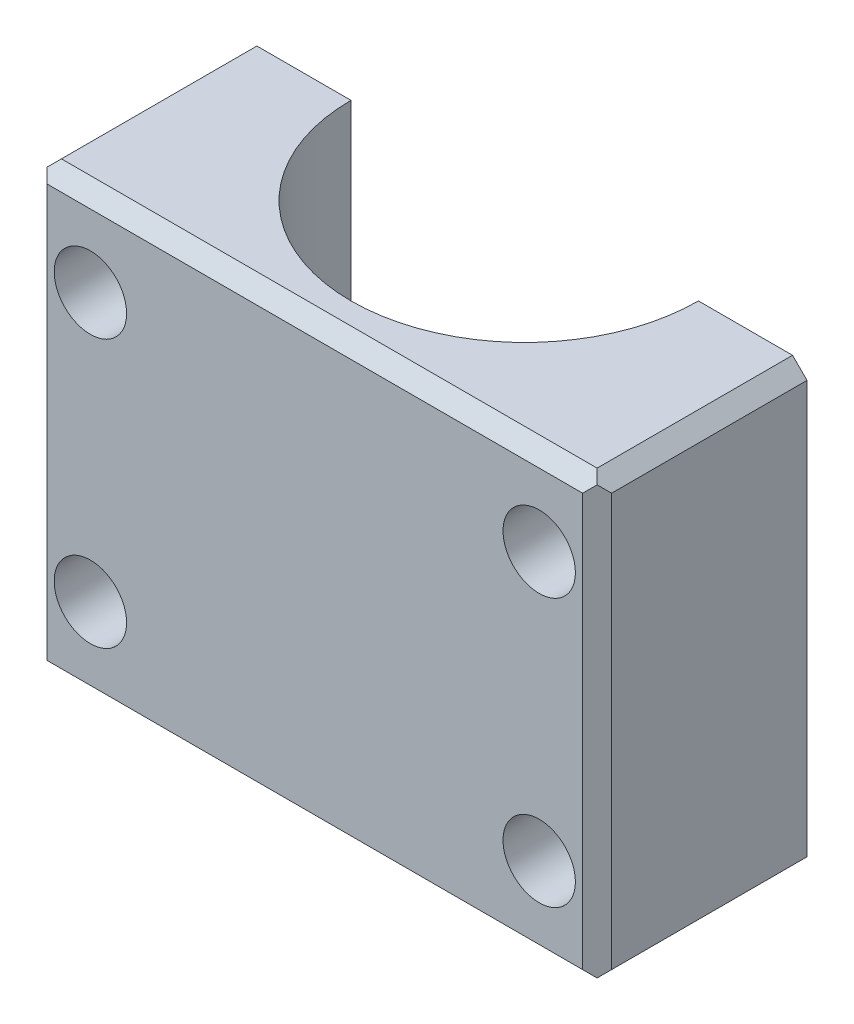
ISO-10303-21;
HEADER;
FILE_DESCRIPTION(('STEP AP214'),'2;1');
FILE_NAME('part.step','',(''),(''),'','','');
FILE_SCHEMA(('AUTOMOTIVE_DESIGN { 1 0 10303 214 1 1 1 1 }'));
ENDSEC;
DATA;
#1=APPLICATION_CONTEXT('core data for automotive mechanical design processes');
#2=APPLICATION_PROTOCOL_DEFINITION('international standard','automotive_design',2000,#1);
#3=PRODUCT_CONTEXT('',#1,'mechanical');
#4=PRODUCT('Part','Part','',(#3));
#5=PRODUCT_RELATED_PRODUCT_CATEGORY('part','',(#4));
#6=PRODUCT_DEFINITION_FORMATION('','',#4);
#7=PRODUCT_DEFINITION_CONTEXT('part definition',#1,'design');
#8=PRODUCT_DEFINITION('design','',#6,#7);
#9=PRODUCT_DEFINITION_SHAPE('','',#8);
#10=(LENGTH_UNIT() NAMED_UNIT(*) SI_UNIT(.MILLI.,.METRE.));
#11=(NAMED_UNIT(*) PLANE_ANGLE_UNIT() SI_UNIT($,.RADIAN.));
#12=(NAMED_UNIT(*) SI_UNIT($,.STERADIAN.) SOLID_ANGLE_UNIT());
#13=UNCERTAINTY_MEASURE_WITH_UNIT(LENGTH_MEASURE(1.E-05),#10,'distance_accuracy_value','');
#14=(GEOMETRIC_REPRESENTATION_CONTEXT(3) GLOBAL_UNCERTAINTY_ASSIGNED_CONTEXT((#13)) GLOBAL_UNIT_ASSIGNED_CONTEXT((#10,
#11,#12)) REPRESENTATION_CONTEXT('',''));
#15=CARTESIAN_POINT('',(0.,0.,0.));
#16=DIRECTION('',(0.,0.,1.));
#17=DIRECTION('',(1.,0.,0.));
#18=AXIS2_PLACEMENT_3D('',#15,#16,#17);
#19=CARTESIAN_POINT('',(0.,-30.5,58.));
#20=DIRECTION('',(0.,1.,0.));
#21=DIRECTION('',(0.,0.,1.));
#22=AXIS2_PLACEMENT_3D('',#19,#20,#21);
#23=PLANE('',#22);
#24=DIRECTION('',(-1.,0.,0.));
#25=VECTOR('',#24,1.);
#26=CARTESIAN_POINT('',(-37.,-30.5,56.));
#27=LINE('',#26,#25);
#28=CARTESIAN_POINT('',(-5.2201532544553,-30.5,56.));
#29=VERTEX_POINT('',#28);
#30=CARTESIAN_POINT('',(-37.,-30.5,56.));
#31=VERTEX_POINT('',#30);
#32=EDGE_CURVE('E268',#29,#31,#27,.T.);
#33=ORIENTED_EDGE('',*,*,#32,.T.);
#34=DIRECTION('',(0.,0.,-1.));
#35=VECTOR('',#34,1.);
#36=CARTESIAN_POINT('',(-37.,-30.5,58.));
#37=LINE('',#36,#35);
#38=CARTESIAN_POINT('',(-37.,-30.5,29.));
#39=VERTEX_POINT('',#38);
#40=EDGE_CURVE('E271',#31,#39,#37,.T.);
#41=ORIENTED_EDGE('',*,*,#40,.T.);
#42=DIRECTION('',(1.,0.,0.));
#43=VECTOR('',#42,1.);
#44=CARTESIAN_POINT('',(0.,-30.5,29.));
#45=LINE('',#44,#43);
#46=CARTESIAN_POINT('',(-27.5,-30.5,29.));
#47=VERTEX_POINT('',#46);
#48=EDGE_CURVE('E204',#39,#47,#45,.T.);
#49=ORIENTED_EDGE('',*,*,#48,.T.);
#50=CARTESIAN_POINT('',(0.,-30.5,29.));
#51=DIRECTION('',(0.,-1.,0.));
#52=DIRECTION('',(0.,0.,-1.));
#53=AXIS2_PLACEMENT_3D('',#50,#51,#52);
#54=CIRCLE('',#53,27.5);
#55=EDGE_CURVE('E199',#29,#47,#54,.T.);
#56=ORIENTED_EDGE('',*,*,#55,.F.);
#57=EDGE_LOOP('',(#33,#41,#49,#56));
#58=FACE_BOUND('',#57,.T.);
#59=ADVANCED_FACE('F16',(#58),#23,.F.);
#60=DIRECTION('',(0.,0.,1.));
#61=VECTOR('',#60,1.);
#62=CARTESIAN_POINT('',(37.,-30.5,56.));
#63=LINE('',#62,#61);
#64=CARTESIAN_POINT('',(37.,-30.5,29.));
#65=VERTEX_POINT('',#64);
#66=CARTESIAN_POINT('',(37.,-30.5,56.));
#67=VERTEX_POINT('',#66);
#68=EDGE_CURVE('E263',#65,#67,#63,.T.);
#69=ORIENTED_EDGE('',*,*,#68,.T.);
#70=DIRECTION('',(-1.,0.,0.));
#71=VECTOR('',#70,1.);
#72=CARTESIAN_POINT('',(-37.,-30.5,56.));
#73=LINE('',#72,#71);
#74=CARTESIAN_POINT('',(5.22015325445528,-30.5,56.));
#75=VERTEX_POINT('',#74);
#76=EDGE_CURVE('E197',#67,#75,#73,.T.);
#77=ORIENTED_EDGE('',*,*,#76,.T.);
#78=CARTESIAN_POINT('',(27.5,-30.5,29.));
#79=VERTEX_POINT('',#78);
#80=EDGE_CURVE('E181',#79,#75,#54,.T.);
#81=ORIENTED_EDGE('',*,*,#80,.F.);
#82=EDGE_CURVE('E194',#79,#65,#45,.T.);
#83=ORIENTED_EDGE('',*,*,#82,.T.);
#84=EDGE_LOOP('',(#69,#77,#81,#83));
#85=FACE_BOUND('',#84,.T.);
#86=ADVANCED_FACE('F193',(#85),#23,.F.);
#87=CARTESIAN_POINT('',(0.,30.502,29.));
#88=DIRECTION('',(0.,-1.,0.));
#89=DIRECTION('',(0.,0.,-1.));
#90=AXIS2_PLACEMENT_3D('',#87,#88,#89);
#91=CYLINDRICAL_SURFACE('',#90,24.);
#92=CARTESIAN_POINT('',(0.,-13.5,29.));
#93=DIRECTION('',(0.,-1.,0.));
#94=DIRECTION('',(0.,0.,-1.));
#95=AXIS2_PLACEMENT_3D('',#92,#93,#94);
#96=CIRCLE('',#95,24.);
#97=CARTESIAN_POINT('',(-24.,-13.5,29.));
#98=VERTEX_POINT('',#97);
#99=CARTESIAN_POINT('',(24.,-13.5,29.));
#100=VERTEX_POINT('',#99);
#101=EDGE_CURVE('E189',#98,#100,#96,.F.);
#102=ORIENTED_EDGE('',*,*,#101,.F.);
#103=DIRECTION('',(0.,-1.,0.));
#104=VECTOR('',#103,1.);
#105=CARTESIAN_POINT('',(-24.,30.502,29.));
#106=LINE('',#105,#104);
#107=CARTESIAN_POINT('',(-24.,30.5,29.));
#108=VERTEX_POINT('',#107);
#109=EDGE_CURVE('E223',#108,#98,#106,.T.);
#110=ORIENTED_EDGE('',*,*,#109,.F.);
#111=CARTESIAN_POINT('',(0.,30.5,29.));
#112=DIRECTION('',(0.,1.,0.));
#113=DIRECTION('',(0.,0.,1.));
#114=AXIS2_PLACEMENT_3D('',#111,#112,#113);
#115=CIRCLE('',#114,24.);
#116=CARTESIAN_POINT('',(24.,30.5,29.));
#117=VERTEX_POINT('',#116);
#118=EDGE_CURVE('E372',#117,#108,#115,.F.);
#119=ORIENTED_EDGE('',*,*,#118,.F.);
#120=DIRECTION('',(0.,-1.,0.));
#121=VECTOR('',#120,1.);
#122=CARTESIAN_POINT('',(24.,30.502,29.));
#123=LINE('',#122,#121);
#124=EDGE_CURVE('E220',#100,#117,#123,.F.);
#125=ORIENTED_EDGE('',*,*,#124,.F.);
#126=EDGE_LOOP('',(#102,#110,#119,#125));
#127=FACE_BOUND('',#126,.T.);
#128=ADVANCED_FACE('F462',(#127),#91,.F.);
#129=CARTESIAN_POINT('',(0.,30.5,58.));
#130=DIRECTION('',(0.,1.,0.));
#131=DIRECTION('',(0.,0.,1.));
#132=AXIS2_PLACEMENT_3D('',#129,#130,#131);
#133=PLANE('',#132);
#134=DIRECTION('',(1.,0.,0.));
#135=VECTOR('',#134,1.);
#136=CARTESIAN_POINT('',(0.,30.5,29.));
#137=LINE('',#136,#135);
#138=CARTESIAN_POINT('',(-37.,30.5,29.));
#139=VERTEX_POINT('',#138);
#140=EDGE_CURVE('E214',#139,#108,#137,.T.);
#141=ORIENTED_EDGE('',*,*,#140,.F.);
#142=DIRECTION('',(0.,0.,1.));
#143=VECTOR('',#142,1.);
#144=CARTESIAN_POINT('',(-37.,30.5,56.));
#145=LINE('',#144,#143);
#146=CARTESIAN_POINT('',(-37.,30.5,56.));
#147=VERTEX_POINT('',#146);
#148=EDGE_CURVE('E306',#139,#147,#145,.T.);
#149=ORIENTED_EDGE('',*,*,#148,.T.);
#150=DIRECTION('',(1.,0.,0.));
#151=VECTOR('',#150,1.);
#152=CARTESIAN_POINT('',(0.,30.5,56.));
#153=LINE('',#152,#151);
#154=CARTESIAN_POINT('',(37.,30.5,56.));
#155=VERTEX_POINT('',#154);
#156=EDGE_CURVE('E303',#147,#155,#153,.T.);
#157=ORIENTED_EDGE('',*,*,#156,.T.);
#158=DIRECTION('',(0.,0.,-1.));
#159=VECTOR('',#158,1.);
#160=CARTESIAN_POINT('',(37.,30.5,58.));
#161=LINE('',#160,#159);
#162=CARTESIAN_POINT('',(37.,30.5,29.));
#163=VERTEX_POINT('',#162);
#164=EDGE_CURVE('E300',#155,#163,#161,.T.);
#165=ORIENTED_EDGE('',*,*,#164,.T.);
#166=EDGE_CURVE('E369',#117,#163,#137,.T.);
#167=ORIENTED_EDGE('',*,*,#166,.F.);
#168=ORIENTED_EDGE('',*,*,#118,.T.);
#169=EDGE_LOOP('',(#141,#149,#157,#165,#167,#168));
#170=FACE_BOUND('',#169,.T.);
#171=ADVANCED_FACE('F367',(#170),#133,.T.);
#172=CARTESIAN_POINT('',(0.,0.,29.));
#173=DIRECTION('',(0.,0.,1.));
#174=DIRECTION('',(1.,0.,0.));
#175=AXIS2_PLACEMENT_3D('',#172,#173,#174);
#176=PLANE('',#175);
#177=CARTESIAN_POINT('',(-31.,18.5,29.));
#178=DIRECTION('',(0.,0.,1.));
#179=DIRECTION('',(1.,0.,0.));
#180=AXIS2_PLACEMENT_3D('',#177,#178,#179);
#181=CIRCLE('',#180,2.6);
#182=CARTESIAN_POINT('',(-28.4,18.5,29.));
#183=VERTEX_POINT('',#182);
#184=EDGE_CURVE('E238',#183,#183,#181,.T.);
#185=ORIENTED_EDGE('',*,*,#184,.T.);
#186=EDGE_LOOP('',(#185));
#187=FACE_BOUND('',#186,.T.);
#188=CARTESIAN_POINT('',(-31.,-18.5,29.));
#189=DIRECTION('',(0.,0.,1.));
#190=DIRECTION('',(1.,0.,0.));
#191=AXIS2_PLACEMENT_3D('',#188,#189,#190);
#192=CIRCLE('',#191,2.6);
#193=CARTESIAN_POINT('',(-28.4,-18.5,29.));
#194=VERTEX_POINT('',#193);
#195=EDGE_CURVE('E232',#194,#194,#192,.T.);
#196=ORIENTED_EDGE('',*,*,#195,.T.);
#197=EDGE_LOOP('',(#196));
#198=FACE_BOUND('',#197,.T.);
#199=ORIENTED_EDGE('',*,*,#48,.F.);
#200=DIRECTION('',(0.707106781186549,-0.707106781186546,0.));
#201=VECTOR('',#200,1.);
#202=CARTESIAN_POINT('',(-37.,-30.5,29.));
#203=LINE('',#202,#201);
#204=CARTESIAN_POINT('',(-39.,-28.5,29.));
#205=VERTEX_POINT('',#204);
#206=EDGE_CURVE('E278',#39,#205,#203,.F.);
#207=ORIENTED_EDGE('',*,*,#206,.T.);
#208=DIRECTION('',(0.,-1.,0.));
#209=VECTOR('',#208,1.);
#210=CARTESIAN_POINT('',(-39.,0.,29.));
#211=LINE('',#210,#209);
#212=CARTESIAN_POINT('',(-39.,28.5,29.));
#213=VERTEX_POINT('',#212);
#214=EDGE_CURVE('E205',#213,#205,#211,.T.);
#215=ORIENTED_EDGE('',*,*,#214,.F.);
#216=DIRECTION('',(0.70710678118655,0.707106781186545,0.));
#217=VECTOR('',#216,1.);
#218=CARTESIAN_POINT('',(-39.,28.5,29.));
#219=LINE('',#218,#217);
#220=EDGE_CURVE('E275',#213,#139,#219,.T.);
#221=ORIENTED_EDGE('',*,*,#220,.T.);
#222=ORIENTED_EDGE('',*,*,#140,.T.);
#223=ORIENTED_EDGE('',*,*,#109,.T.);
#224=DIRECTION('',(1.,0.,0.));
#225=VECTOR('',#224,1.);
#226=CARTESIAN_POINT('',(0.,-13.5,29.));
#227=LINE('',#226,#225);
#228=CARTESIAN_POINT('',(-27.5,-13.5,29.));
#229=VERTEX_POINT('',#228);
#230=EDGE_CURVE('E382',#229,#98,#227,.T.);
#231=ORIENTED_EDGE('',*,*,#230,.F.);
#232=DIRECTION('',(0.,-1.,0.));
#233=VECTOR('',#232,1.);
#234=CARTESIAN_POINT('',(-27.5,-13.5,29.));
#235=LINE('',#234,#233);
#236=EDGE_CURVE('E376',#229,#47,#235,.T.);
#237=ORIENTED_EDGE('',*,*,#236,.T.);
#238=EDGE_LOOP('',(#199,#207,#215,#221,#222,#223,#231,#237));
#239=FACE_BOUND('',#238,.T.);
#240=ADVANCED_FACE('F436',(#187,#198,#239),#176,.F.);
#241=CARTESIAN_POINT('',(-39.,0.,58.));
#242=DIRECTION('',(1.,0.,0.));
#243=DIRECTION('',(0.,0.,-1.));
#244=AXIS2_PLACEMENT_3D('',#241,#242,#243);
#245=PLANE('',#244);
#246=ORIENTED_EDGE('',*,*,#214,.T.);
#247=DIRECTION('',(0.,0.,1.));
#248=VECTOR('',#247,1.);
#249=CARTESIAN_POINT('',(-39.,-28.5,58.));
#250=LINE('',#249,#248);
#251=CARTESIAN_POINT('',(-39.,-28.5,56.));
#252=VERTEX_POINT('',#251);
#253=EDGE_CURVE('E285',#205,#252,#250,.T.);
#254=ORIENTED_EDGE('',*,*,#253,.T.);
#255=DIRECTION('',(0.,1.,0.));
#256=VECTOR('',#255,1.);
#257=CARTESIAN_POINT('',(-39.,30.5,56.));
#258=LINE('',#257,#256);
#259=CARTESIAN_POINT('',(-39.,28.5,56.));
#260=VERTEX_POINT('',#259);
#261=EDGE_CURVE('E259',#252,#260,#258,.T.);
#262=ORIENTED_EDGE('',*,*,#261,.T.);
#263=DIRECTION('',(0.,0.,-1.));
#264=VECTOR('',#263,1.);
#265=CARTESIAN_POINT('',(-39.,28.5,29.));
#266=LINE('',#265,#264);
#267=EDGE_CURVE('E281',#260,#213,#266,.T.);
#268=ORIENTED_EDGE('',*,*,#267,.T.);
#269=EDGE_LOOP('',(#246,#254,#262,#268));
#270=FACE_BOUND('',#269,.T.);
#271=ADVANCED_FACE('F467',(#270),#245,.F.);
#272=CARTESIAN_POINT('',(39.,0.,58.));
#273=DIRECTION('',(1.,0.,0.));
#274=DIRECTION('',(0.,1.,0.));
#275=AXIS2_PLACEMENT_3D('',#272,#273,#274);
#276=PLANE('',#275);
#277=DIRECTION('',(0.,-1.,0.));
#278=VECTOR('',#277,1.);
#279=CARTESIAN_POINT('',(39.,0.,56.));
#280=LINE('',#279,#278);
#281=CARTESIAN_POINT('',(39.,28.5,56.));
#282=VERTEX_POINT('',#281);
#283=CARTESIAN_POINT('',(39.,-28.5,56.));
#284=VERTEX_POINT('',#283);
#285=EDGE_CURVE('E188',#282,#284,#280,.T.);
#286=ORIENTED_EDGE('',*,*,#285,.T.);
#287=DIRECTION('',(0.,0.,-1.));
#288=VECTOR('',#287,1.);
#289=CARTESIAN_POINT('',(39.,-28.5,29.));
#290=LINE('',#289,#288);
#291=CARTESIAN_POINT('',(39.,-28.5,29.));
#292=VERTEX_POINT('',#291);
#293=EDGE_CURVE('E39',#284,#292,#290,.T.);
#294=ORIENTED_EDGE('',*,*,#293,.T.);
#295=DIRECTION('',(0.,-1.,0.));
#296=VECTOR('',#295,1.);
#297=CARTESIAN_POINT('',(39.,0.,29.));
#298=LINE('',#297,#296);
#299=CARTESIAN_POINT('',(39.,28.5,29.));
#300=VERTEX_POINT('',#299);
#301=EDGE_CURVE('E211',#300,#292,#298,.T.);
#302=ORIENTED_EDGE('',*,*,#301,.F.);
#303=DIRECTION('',(0.,0.,1.));
#304=VECTOR('',#303,1.);
#305=CARTESIAN_POINT('',(39.,28.5,58.));
#306=LINE('',#305,#304);
#307=EDGE_CURVE('E330',#300,#282,#306,.T.);
#308=ORIENTED_EDGE('',*,*,#307,.T.);
#309=EDGE_LOOP('',(#286,#294,#302,#308));
#310=FACE_BOUND('',#309,.T.);
#311=ADVANCED_FACE('F465',(#310),#276,.T.);
#312=CARTESIAN_POINT('',(0.,0.,58.));
#313=DIRECTION('',(0.,0.,1.));
#314=DIRECTION('',(1.,0.,0.));
#315=AXIS2_PLACEMENT_3D('',#312,#313,#314);
#316=PLANE('',#315);
#317=CARTESIAN_POINT('',(-31.,-18.5,58.));
#318=DIRECTION('',(0.,0.,1.));
#319=DIRECTION('',(1.,0.,0.));
#320=AXIS2_PLACEMENT_3D('',#317,#318,#319);
#321=CIRCLE('',#320,5.);
#322=CARTESIAN_POINT('',(-26.,-18.5,58.));
#323=VERTEX_POINT('',#322);
#324=EDGE_CURVE('E400',#323,#323,#321,.T.);
#325=ORIENTED_EDGE('',*,*,#324,.F.);
#326=EDGE_LOOP('',(#325));
#327=FACE_BOUND('',#326,.T.);
#328=CARTESIAN_POINT('',(-31.,18.5,58.));
#329=DIRECTION('',(0.,0.,1.));
#330=DIRECTION('',(1.,0.,0.));
#331=AXIS2_PLACEMENT_3D('',#328,#329,#330);
#332=CIRCLE('',#331,5.);
#333=CARTESIAN_POINT('',(-26.,18.5,58.));
#334=VERTEX_POINT('',#333);
#335=EDGE_CURVE('E408',#334,#334,#332,.T.);
#336=ORIENTED_EDGE('',*,*,#335,.F.);
#337=EDGE_LOOP('',(#336));
#338=FACE_BOUND('',#337,.T.);
#339=CARTESIAN_POINT('',(31.,18.5,58.));
#340=DIRECTION('',(0.,0.,1.));
#341=DIRECTION('',(1.,0.,0.));
#342=AXIS2_PLACEMENT_3D('',#339,#340,#341);
#343=CIRCLE('',#342,5.);
#344=CARTESIAN_POINT('',(36.,18.5,58.));
#345=VERTEX_POINT('',#344);
#346=EDGE_CURVE('E416',#345,#345,#343,.T.);
#347=ORIENTED_EDGE('',*,*,#346,.F.);
#348=EDGE_LOOP('',(#347));
#349=FACE_BOUND('',#348,.T.);
#350=CARTESIAN_POINT('',(31.,-18.5,58.));
#351=DIRECTION('',(0.,0.,1.));
#352=DIRECTION('',(1.,0.,0.));
#353=AXIS2_PLACEMENT_3D('',#350,#351,#352);
#354=CIRCLE('',#353,5.);
#355=CARTESIAN_POINT('',(36.,-18.5,58.));
#356=VERTEX_POINT('',#355);
#357=EDGE_CURVE('E391',#356,#356,#354,.T.);
#358=ORIENTED_EDGE('',*,*,#357,.F.);
#359=EDGE_LOOP('',(#358));
#360=FACE_BOUND('',#359,.T.);
#361=DIRECTION('',(0.,-1.,0.));
#362=VECTOR('',#361,1.);
#363=CARTESIAN_POINT('',(-37.,-30.5,58.));
#364=LINE('',#363,#362);
#365=CARTESIAN_POINT('',(-37.,28.5,58.));
#366=VERTEX_POINT('',#365);
#367=CARTESIAN_POINT('',(-37.,-28.5,58.));
#368=VERTEX_POINT('',#367);
#369=EDGE_CURVE('E251',#366,#368,#364,.T.);
#370=ORIENTED_EDGE('',*,*,#369,.T.);
#371=DIRECTION('',(1.,0.,0.));
#372=VECTOR('',#371,1.);
#373=CARTESIAN_POINT('',(37.,-28.5,58.));
#374=LINE('',#373,#372);
#375=CARTESIAN_POINT('',(37.,-28.5,58.));
#376=VERTEX_POINT('',#375);
#377=EDGE_CURVE('E312',#368,#376,#374,.T.);
#378=ORIENTED_EDGE('',*,*,#377,.T.);
#379=DIRECTION('',(0.,1.,0.));
#380=VECTOR('',#379,1.);
#381=CARTESIAN_POINT('',(37.,0.,58.));
#382=LINE('',#381,#380);
#383=CARTESIAN_POINT('',(37.,28.5,58.));
#384=VERTEX_POINT('',#383);
#385=EDGE_CURVE('E255',#376,#384,#382,.T.);
#386=ORIENTED_EDGE('',*,*,#385,.T.);
#387=DIRECTION('',(-1.,0.,0.));
#388=VECTOR('',#387,1.);
#389=CARTESIAN_POINT('',(0.,28.5,58.));
#390=LINE('',#389,#388);
#391=EDGE_CURVE('E309',#384,#366,#390,.T.);
#392=ORIENTED_EDGE('',*,*,#391,.T.);
#393=EDGE_LOOP('',(#370,#378,#386,#392));
#394=FACE_BOUND('',#393,.T.);
#395=ADVANCED_FACE('F631',(#327,#338,#349,#360,#394),#316,.T.);
#396=CARTESIAN_POINT('',(31.,18.5,29.));
#397=DIRECTION('',(0.,0.,1.));
#398=DIRECTION('',(1.,0.,0.));
#399=AXIS2_PLACEMENT_3D('',#396,#397,#398);
#400=CIRCLE('',#399,2.6);
#401=CARTESIAN_POINT('',(33.6,18.5,29.));
#402=VERTEX_POINT('',#401);
#403=EDGE_CURVE('E243',#402,#402,#400,.T.);
#404=ORIENTED_EDGE('',*,*,#403,.T.);
#405=EDGE_LOOP('',(#404));
#406=FACE_BOUND('',#405,.T.);
#407=CARTESIAN_POINT('',(31.,-18.5,29.));
#408=DIRECTION('',(0.,0.,1.));
#409=DIRECTION('',(1.,0.,0.));
#410=AXIS2_PLACEMENT_3D('',#407,#408,#409);
#411=CIRCLE('',#410,2.6);
#412=CARTESIAN_POINT('',(33.6,-18.5,29.));
#413=VERTEX_POINT('',#412);
#414=EDGE_CURVE('E248',#413,#413,#411,.T.);
#415=ORIENTED_EDGE('',*,*,#414,.T.);
#416=EDGE_LOOP('',(#415));
#417=FACE_BOUND('',#416,.T.);
#418=ORIENTED_EDGE('',*,*,#301,.T.);
#419=DIRECTION('',(-0.707106781186549,-0.707106781186546,0.));
#420=VECTOR('',#419,1.);
#421=CARTESIAN_POINT('',(39.,-28.5,29.));
#422=LINE('',#421,#420);
#423=EDGE_CURVE('E10',#292,#65,#422,.T.);
#424=ORIENTED_EDGE('',*,*,#423,.T.);
#425=ORIENTED_EDGE('',*,*,#82,.F.);
#426=DIRECTION('',(0.,-1.,0.));
#427=VECTOR('',#426,1.);
#428=CARTESIAN_POINT('',(27.5,-13.5,29.));
#429=LINE('',#428,#427);
#430=CARTESIAN_POINT('',(27.5,-13.5,29.));
#431=VERTEX_POINT('',#430);
#432=EDGE_CURVE('E178',#79,#431,#429,.F.);
#433=ORIENTED_EDGE('',*,*,#432,.T.);
#434=DIRECTION('',(1.,0.,0.));
#435=VECTOR('',#434,1.);
#436=CARTESIAN_POINT('',(0.,-13.5,29.));
#437=LINE('',#436,#435);
#438=EDGE_CURVE('E386',#100,#431,#437,.T.);
#439=ORIENTED_EDGE('',*,*,#438,.F.);
#440=ORIENTED_EDGE('',*,*,#124,.T.);
#441=ORIENTED_EDGE('',*,*,#166,.T.);
#442=DIRECTION('',(-0.707106781186549,0.707106781186546,0.));
#443=VECTOR('',#442,1.);
#444=CARTESIAN_POINT('',(37.,30.5,29.));
#445=LINE('',#444,#443);
#446=EDGE_CURVE('E26',#163,#300,#445,.F.);
#447=ORIENTED_EDGE('',*,*,#446,.T.);
#448=EDGE_LOOP('',(#418,#424,#425,#433,#439,#440,#441,#447));
#449=FACE_BOUND('',#448,.T.);
#450=ADVANCED_FACE('F201',(#406,#417,#449),#176,.F.);
#451=CARTESIAN_POINT('',(0.,-13.5,29.));
#452=DIRECTION('',(0.,-1.,0.));
#453=DIRECTION('',(0.,0.,-1.));
#454=AXIS2_PLACEMENT_3D('',#451,#452,#453);
#455=CYLINDRICAL_SURFACE('',#454,27.5);
#456=ORIENTED_EDGE('',*,*,#80,.T.);
#457=CARTESIAN_POINT('',(0.,-57.5,29.));
#458=DIRECTION('',(0.,-0.707106781186548,0.707106781186547));
#459=DIRECTION('',(0.,-0.707106781186547,-0.707106781186548));
#460=AXIS2_PLACEMENT_3D('',#457,#458,#459);
#461=ELLIPSE('',#460,38.8908729652601,27.5);
#462=EDGE_CURVE('E327',#75,#29,#461,.T.);
#463=ORIENTED_EDGE('',*,*,#462,.T.);
#464=ORIENTED_EDGE('',*,*,#55,.T.);
#465=ORIENTED_EDGE('',*,*,#236,.F.);
#466=CARTESIAN_POINT('',(0.,-13.5,29.));
#467=DIRECTION('',(0.,-1.,0.));
#468=DIRECTION('',(0.,0.,-1.));
#469=AXIS2_PLACEMENT_3D('',#466,#467,#468);
#470=CIRCLE('',#469,27.5);
#471=EDGE_CURVE('E184',#431,#229,#470,.T.);
#472=ORIENTED_EDGE('',*,*,#471,.F.);
#473=ORIENTED_EDGE('',*,*,#432,.F.);
#474=EDGE_LOOP('',(#456,#463,#464,#465,#472,#473));
#475=FACE_BOUND('',#474,.T.);
#476=ADVANCED_FACE('F180',(#475),#455,.F.);
#477=CARTESIAN_POINT('',(0.,-13.5,29.75));
#478=DIRECTION('',(0.,-1.,0.));
#479=DIRECTION('',(1.,0.,0.));
#480=AXIS2_PLACEMENT_3D('',#477,#478,#479);
#481=PLANE('',#480);
#482=ORIENTED_EDGE('',*,*,#230,.T.);
#483=ORIENTED_EDGE('',*,*,#101,.T.);
#484=ORIENTED_EDGE('',*,*,#438,.T.);
#485=ORIENTED_EDGE('',*,*,#471,.T.);
#486=EDGE_LOOP('',(#482,#483,#484,#485));
#487=FACE_BOUND('',#486,.T.);
#488=ADVANCED_FACE('F593',(#487),#481,.T.);
#489=CARTESIAN_POINT('',(31.,-18.5,50.));
#490=DIRECTION('',(0.,0.,1.));
#491=DIRECTION('',(1.,0.,0.));
#492=AXIS2_PLACEMENT_3D('',#489,#490,#491);
#493=CYLINDRICAL_SURFACE('',#492,5.);
#494=CARTESIAN_POINT('',(31.,-18.5,50.));
#495=DIRECTION('',(0.,0.,1.));
#496=DIRECTION('',(1.,0.,0.));
#497=AXIS2_PLACEMENT_3D('',#494,#495,#496);
#498=CIRCLE('',#497,5.);
#499=CARTESIAN_POINT('',(36.,-18.5,50.));
#500=VERTEX_POINT('',#499);
#501=EDGE_CURVE('E395',#500,#500,#498,.T.);
#502=ORIENTED_EDGE('',*,*,#501,.F.);
#503=EDGE_LOOP('',(#502));
#504=FACE_BOUND('',#503,.T.);
#505=ORIENTED_EDGE('',*,*,#357,.T.);
#506=EDGE_LOOP('',(#505));
#507=FACE_BOUND('',#506,.T.);
#508=ADVANCED_FACE('F572',(#504,#507),#493,.F.);
#509=CARTESIAN_POINT('',(0.,0.,50.));
#510=DIRECTION('',(0.,0.,1.));
#511=DIRECTION('',(1.,0.,0.));
#512=AXIS2_PLACEMENT_3D('',#509,#510,#511);
#513=PLANE('',#512);
#514=CARTESIAN_POINT('',(31.,-18.5,50.));
#515=DIRECTION('',(0.,0.,1.));
#516=DIRECTION('',(1.,0.,0.));
#517=AXIS2_PLACEMENT_3D('',#514,#515,#516);
#518=CIRCLE('',#517,2.6);
#519=CARTESIAN_POINT('',(33.6,-18.5,50.));
#520=VERTEX_POINT('',#519);
#521=EDGE_CURVE('E244',#520,#520,#518,.T.);
#522=ORIENTED_EDGE('',*,*,#521,.F.);
#523=EDGE_LOOP('',(#522));
#524=FACE_BOUND('',#523,.T.);
#525=ORIENTED_EDGE('',*,*,#501,.T.);
#526=EDGE_LOOP('',(#525));
#527=FACE_BOUND('',#526,.T.);
#528=ADVANCED_FACE('F568',(#524,#527),#513,.T.);
#529=CARTESIAN_POINT('',(31.,18.5,50.));
#530=DIRECTION('',(0.,0.,1.));
#531=DIRECTION('',(1.,0.,0.));
#532=AXIS2_PLACEMENT_3D('',#529,#530,#531);
#533=CYLINDRICAL_SURFACE('',#532,5.);
#534=CARTESIAN_POINT('',(31.,18.5,50.));
#535=DIRECTION('',(0.,0.,1.));
#536=DIRECTION('',(1.,0.,0.));
#537=AXIS2_PLACEMENT_3D('',#534,#535,#536);
#538=CIRCLE('',#537,5.);
#539=CARTESIAN_POINT('',(36.,18.5,50.));
#540=VERTEX_POINT('',#539);
#541=EDGE_CURVE('E396',#540,#540,#538,.T.);
#542=ORIENTED_EDGE('',*,*,#541,.F.);
#543=EDGE_LOOP('',(#542));
#544=FACE_BOUND('',#543,.T.);
#545=ORIENTED_EDGE('',*,*,#346,.T.);
#546=EDGE_LOOP('',(#545));
#547=FACE_BOUND('',#546,.T.);
#548=ADVANCED_FACE('F563',(#544,#547),#533,.F.);
#549=CARTESIAN_POINT('',(0.,0.,50.));
#550=DIRECTION('',(0.,0.,1.));
#551=DIRECTION('',(1.,0.,0.));
#552=AXIS2_PLACEMENT_3D('',#549,#550,#551);
#553=PLANE('',#552);
#554=CARTESIAN_POINT('',(31.,18.5,50.));
#555=DIRECTION('',(0.,0.,1.));
#556=DIRECTION('',(1.,0.,0.));
#557=AXIS2_PLACEMENT_3D('',#554,#555,#556);
#558=CIRCLE('',#557,2.6);
#559=CARTESIAN_POINT('',(33.6,18.5,50.));
#560=VERTEX_POINT('',#559);
#561=EDGE_CURVE('E239',#560,#560,#558,.T.);
#562=ORIENTED_EDGE('',*,*,#561,.F.);
#563=EDGE_LOOP('',(#562));
#564=FACE_BOUND('',#563,.T.);
#565=ORIENTED_EDGE('',*,*,#541,.T.);
#566=EDGE_LOOP('',(#565));
#567=FACE_BOUND('',#566,.T.);
#568=ADVANCED_FACE('F559',(#564,#567),#553,.T.);
#569=CARTESIAN_POINT('',(-31.,18.5,50.));
#570=DIRECTION('',(0.,0.,1.));
#571=DIRECTION('',(1.,0.,0.));
#572=AXIS2_PLACEMENT_3D('',#569,#570,#571);
#573=CYLINDRICAL_SURFACE('',#572,5.);
#574=CARTESIAN_POINT('',(-31.,18.5,50.));
#575=DIRECTION('',(0.,0.,1.));
#576=DIRECTION('',(1.,0.,0.));
#577=AXIS2_PLACEMENT_3D('',#574,#575,#576);
#578=CIRCLE('',#577,5.);
#579=CARTESIAN_POINT('',(-26.,18.5,50.));
#580=VERTEX_POINT('',#579);
#581=EDGE_CURVE('E412',#580,#580,#578,.T.);
#582=ORIENTED_EDGE('',*,*,#581,.F.);
#583=EDGE_LOOP('',(#582));
#584=FACE_BOUND('',#583,.T.);
#585=ORIENTED_EDGE('',*,*,#335,.T.);
#586=EDGE_LOOP('',(#585));
#587=FACE_BOUND('',#586,.T.);
#588=ADVANCED_FACE('F550',(#584,#587),#573,.F.);
#589=CARTESIAN_POINT('',(0.,0.,50.));
#590=DIRECTION('',(0.,0.,1.));
#591=DIRECTION('',(1.,0.,0.));
#592=AXIS2_PLACEMENT_3D('',#589,#590,#591);
#593=PLANE('',#592);
#594=CARTESIAN_POINT('',(-31.,18.5,50.));
#595=DIRECTION('',(0.,0.,1.));
#596=DIRECTION('',(1.,0.,0.));
#597=AXIS2_PLACEMENT_3D('',#594,#595,#596);
#598=CIRCLE('',#597,2.6);
#599=CARTESIAN_POINT('',(-28.4,18.5,50.));
#600=VERTEX_POINT('',#599);
#601=EDGE_CURVE('E234',#600,#600,#598,.T.);
#602=ORIENTED_EDGE('',*,*,#601,.F.);
#603=EDGE_LOOP('',(#602));
#604=FACE_BOUND('',#603,.T.);
#605=ORIENTED_EDGE('',*,*,#581,.T.);
#606=EDGE_LOOP('',(#605));
#607=FACE_BOUND('',#606,.T.);
#608=ADVANCED_FACE('F546',(#604,#607),#593,.T.);
#609=CARTESIAN_POINT('',(-31.,-18.5,50.));
#610=DIRECTION('',(0.,0.,1.));
#611=DIRECTION('',(1.,0.,0.));
#612=AXIS2_PLACEMENT_3D('',#609,#610,#611);
#613=CYLINDRICAL_SURFACE('',#612,5.);
#614=CARTESIAN_POINT('',(-31.,-18.5,50.));
#615=DIRECTION('',(0.,0.,1.));
#616=DIRECTION('',(1.,0.,0.));
#617=AXIS2_PLACEMENT_3D('',#614,#615,#616);
#618=CIRCLE('',#617,5.);
#619=CARTESIAN_POINT('',(-26.,-18.5,50.));
#620=VERTEX_POINT('',#619);
#621=EDGE_CURVE('E404',#620,#620,#618,.T.);
#622=ORIENTED_EDGE('',*,*,#621,.F.);
#623=EDGE_LOOP('',(#622));
#624=FACE_BOUND('',#623,.T.);
#625=ORIENTED_EDGE('',*,*,#324,.T.);
#626=EDGE_LOOP('',(#625));
#627=FACE_BOUND('',#626,.T.);
#628=ADVANCED_FACE('F453',(#624,#627),#613,.F.);
#629=CARTESIAN_POINT('',(0.,0.,50.));
#630=DIRECTION('',(0.,0.,1.));
#631=DIRECTION('',(1.,0.,0.));
#632=AXIS2_PLACEMENT_3D('',#629,#630,#631);
#633=PLANE('',#632);
#634=CARTESIAN_POINT('',(-31.,-18.5,50.));
#635=DIRECTION('',(0.,0.,1.));
#636=DIRECTION('',(1.,0.,0.));
#637=AXIS2_PLACEMENT_3D('',#634,#635,#636);
#638=CIRCLE('',#637,2.6);
#639=CARTESIAN_POINT('',(-28.4,-18.5,50.));
#640=VERTEX_POINT('',#639);
#641=EDGE_CURVE('E228',#640,#640,#638,.T.);
#642=ORIENTED_EDGE('',*,*,#641,.F.);
#643=EDGE_LOOP('',(#642));
#644=FACE_BOUND('',#643,.T.);
#645=ORIENTED_EDGE('',*,*,#621,.T.);
#646=EDGE_LOOP('',(#645));
#647=FACE_BOUND('',#646,.T.);
#648=ADVANCED_FACE('F442',(#644,#647),#633,.T.);
#649=CARTESIAN_POINT('',(-31.,-18.5,10.));
#650=DIRECTION('',(0.,0.,1.));
#651=DIRECTION('',(1.,0.,0.));
#652=AXIS2_PLACEMENT_3D('',#649,#650,#651);
#653=CYLINDRICAL_SURFACE('',#652,2.6);
#654=ORIENTED_EDGE('',*,*,#641,.T.);
#655=EDGE_LOOP('',(#654));
#656=FACE_BOUND('',#655,.T.);
#657=ORIENTED_EDGE('',*,*,#195,.F.);
#658=EDGE_LOOP('',(#657));
#659=FACE_BOUND('',#658,.T.);
#660=ADVANCED_FACE('F439',(#656,#659),#653,.F.);
#661=CARTESIAN_POINT('',(-31.,18.5,10.));
#662=DIRECTION('',(0.,0.,1.));
#663=DIRECTION('',(1.,0.,0.));
#664=AXIS2_PLACEMENT_3D('',#661,#662,#663);
#665=CYLINDRICAL_SURFACE('',#664,2.6);
#666=ORIENTED_EDGE('',*,*,#601,.T.);
#667=EDGE_LOOP('',(#666));
#668=FACE_BOUND('',#667,.T.);
#669=ORIENTED_EDGE('',*,*,#184,.F.);
#670=EDGE_LOOP('',(#669));
#671=FACE_BOUND('',#670,.T.);
#672=ADVANCED_FACE('F441',(#668,#671),#665,.F.);
#673=CARTESIAN_POINT('',(31.,18.5,10.));
#674=DIRECTION('',(0.,0.,1.));
#675=DIRECTION('',(1.,0.,0.));
#676=AXIS2_PLACEMENT_3D('',#673,#674,#675);
#677=CYLINDRICAL_SURFACE('',#676,2.6);
#678=ORIENTED_EDGE('',*,*,#561,.T.);
#679=EDGE_LOOP('',(#678));
#680=FACE_BOUND('',#679,.T.);
#681=ORIENTED_EDGE('',*,*,#403,.F.);
#682=EDGE_LOOP('',(#681));
#683=FACE_BOUND('',#682,.T.);
#684=ADVANCED_FACE('F450',(#680,#683),#677,.F.);
#685=CARTESIAN_POINT('',(31.,-18.5,10.));
#686=DIRECTION('',(0.,0.,1.));
#687=DIRECTION('',(1.,0.,0.));
#688=AXIS2_PLACEMENT_3D('',#685,#686,#687);
#689=CYLINDRICAL_SURFACE('',#688,2.6);
#690=ORIENTED_EDGE('',*,*,#521,.T.);
#691=EDGE_LOOP('',(#690));
#692=FACE_BOUND('',#691,.T.);
#693=ORIENTED_EDGE('',*,*,#414,.F.);
#694=EDGE_LOOP('',(#693));
#695=FACE_BOUND('',#694,.T.);
#696=ADVANCED_FACE('F477',(#692,#695),#689,.F.);
#697=CARTESIAN_POINT('',(39.,0.,56.));
#698=DIRECTION('',(-0.707106781186548,0.,-0.707106781186548));
#699=DIRECTION('',(0.,-1.,0.));
#700=AXIS2_PLACEMENT_3D('',#697,#698,#699);
#701=PLANE('',#700);
#702=ORIENTED_EDGE('',*,*,#385,.F.);
#703=DIRECTION('',(-0.577350269189626,0.577350269189625,0.577350269189626));
#704=VECTOR('',#703,1.);
#705=CARTESIAN_POINT('',(28.8333333333333,-20.3333333333334,66.1666666666667));
#706=LINE('',#705,#704);
#707=CARTESIAN_POINT('',(38.,-29.5,57.));
#708=VERTEX_POINT('',#707);
#709=EDGE_CURVE('E324',#376,#708,#706,.F.);
#710=ORIENTED_EDGE('',*,*,#709,.T.);
#711=DIRECTION('',(-0.577350269189627,-0.577350269189624,0.577350269189627));
#712=VECTOR('',#711,1.);
#713=CARTESIAN_POINT('',(48.5,-19.,46.5));
#714=LINE('',#713,#712);
#715=EDGE_CURVE('E321',#708,#284,#714,.F.);
#716=ORIENTED_EDGE('',*,*,#715,.T.);
#717=ORIENTED_EDGE('',*,*,#285,.F.);
#718=DIRECTION('',(-0.577350269189627,0.577350269189625,0.577350269189626));
#719=VECTOR('',#718,1.);
#720=CARTESIAN_POINT('',(48.5,19.,46.5));
#721=LINE('',#720,#719);
#722=CARTESIAN_POINT('',(38.,29.5,57.));
#723=VERTEX_POINT('',#722);
#724=EDGE_CURVE('E315',#282,#723,#721,.T.);
#725=ORIENTED_EDGE('',*,*,#724,.T.);
#726=DIRECTION('',(-0.577350269189626,-0.577350269189626,0.577350269189626));
#727=VECTOR('',#726,1.);
#728=CARTESIAN_POINT('',(28.8333333333333,20.3333333333334,66.1666666666667));
#729=LINE('',#728,#727);
#730=EDGE_CURVE('E318',#723,#384,#729,.T.);
#731=ORIENTED_EDGE('',*,*,#730,.T.);
#732=EDGE_LOOP('',(#702,#710,#716,#717,#725,#731));
#733=FACE_BOUND('',#732,.T.);
#734=ADVANCED_FACE('F473',(#733),#701,.F.);
#735=CARTESIAN_POINT('',(-37.,0.,58.));
#736=DIRECTION('',(-0.707106781186548,0.,0.707106781186548));
#737=DIRECTION('',(0.,1.,0.));
#738=AXIS2_PLACEMENT_3D('',#735,#736,#737);
#739=PLANE('',#738);
#740=ORIENTED_EDGE('',*,*,#261,.F.);
#741=DIRECTION('',(-0.577350269189627,0.577350269189624,-0.577350269189627));
#742=VECTOR('',#741,1.);
#743=CARTESIAN_POINT('',(-47.1666666666667,-20.3333333333334,47.8333333333334));
#744=LINE('',#743,#742);
#745=CARTESIAN_POINT('',(-38.,-29.5,57.));
#746=VERTEX_POINT('',#745);
#747=EDGE_CURVE('E297',#252,#746,#744,.F.);
#748=ORIENTED_EDGE('',*,*,#747,.T.);
#749=DIRECTION('',(0.577350269189626,0.577350269189625,0.577350269189626));
#750=VECTOR('',#749,1.);
#751=CARTESIAN_POINT('',(-27.5,-19.,67.5));
#752=LINE('',#751,#750);
#753=EDGE_CURVE('E294',#746,#368,#752,.T.);
#754=ORIENTED_EDGE('',*,*,#753,.T.);
#755=ORIENTED_EDGE('',*,*,#369,.F.);
#756=DIRECTION('',(0.577350269189626,-0.577350269189626,0.577350269189626));
#757=VECTOR('',#756,1.);
#758=CARTESIAN_POINT('',(-27.5,19.,67.5));
#759=LINE('',#758,#757);
#760=CARTESIAN_POINT('',(-38.,29.5,57.));
#761=VERTEX_POINT('',#760);
#762=EDGE_CURVE('E288',#366,#761,#759,.F.);
#763=ORIENTED_EDGE('',*,*,#762,.T.);
#764=DIRECTION('',(-0.577350269189627,-0.577350269189623,-0.577350269189627));
#765=VECTOR('',#764,1.);
#766=CARTESIAN_POINT('',(-47.1666666666666,20.3333333333334,47.8333333333334));
#767=LINE('',#766,#765);
#768=EDGE_CURVE('E291',#761,#260,#767,.T.);
#769=ORIENTED_EDGE('',*,*,#768,.T.);
#770=EDGE_LOOP('',(#740,#748,#754,#755,#763,#769));
#771=FACE_BOUND('',#770,.T.);
#772=ADVANCED_FACE('F476',(#771),#739,.T.);
#773=CARTESIAN_POINT('',(39.,-28.5,58.));
#774=DIRECTION('',(0.707106781186546,-0.707106781186549,0.));
#775=DIRECTION('',(0.,0.,1.));
#776=AXIS2_PLACEMENT_3D('',#773,#774,#775);
#777=PLANE('',#776);
#778=ORIENTED_EDGE('',*,*,#293,.F.);
#779=ORIENTED_EDGE('',*,*,#715,.F.);
#780=DIRECTION('',(0.577350269189628,0.577350269189625,0.577350269189626));
#781=VECTOR('',#780,1.);
#782=CARTESIAN_POINT('',(26.,-41.5,45.));
#783=LINE('',#782,#781);
#784=EDGE_CURVE('E233',#67,#708,#783,.T.);
#785=ORIENTED_EDGE('',*,*,#784,.F.);
#786=ORIENTED_EDGE('',*,*,#68,.F.);
#787=ORIENTED_EDGE('',*,*,#423,.F.);
#788=EDGE_LOOP('',(#778,#779,#785,#786,#787));
#789=FACE_BOUND('',#788,.T.);
#790=ADVANCED_FACE('F481',(#789),#777,.T.);
#791=CARTESIAN_POINT('',(0.,-28.5,58.));
#792=DIRECTION('',(0.,-0.707106781186548,0.707106781186547));
#793=DIRECTION('',(-1.,0.,0.));
#794=AXIS2_PLACEMENT_3D('',#791,#792,#793);
#795=PLANE('',#794);
#796=ORIENTED_EDGE('',*,*,#377,.F.);
#797=ORIENTED_EDGE('',*,*,#753,.F.);
#798=DIRECTION('',(0.577350269189628,-0.577350269189625,-0.577350269189625));
#799=VECTOR('',#798,1.);
#800=CARTESIAN_POINT('',(-37.6666666666667,-29.8333333333333,56.6666666666667));
#801=LINE('',#800,#799);
#802=EDGE_CURVE('E337',#31,#746,#801,.F.);
#803=ORIENTED_EDGE('',*,*,#802,.F.);
#804=ORIENTED_EDGE('',*,*,#32,.F.);
#805=ORIENTED_EDGE('',*,*,#462,.F.);
#806=ORIENTED_EDGE('',*,*,#76,.F.);
#807=ORIENTED_EDGE('',*,*,#784,.T.);
#808=ORIENTED_EDGE('',*,*,#709,.F.);
#809=EDGE_LOOP('',(#796,#797,#803,#804,#805,#806,#807,#808));
#810=FACE_BOUND('',#809,.T.);
#811=ADVANCED_FACE('F486',(#810),#795,.T.);
#812=CARTESIAN_POINT('',(-37.,-30.5,58.));
#813=DIRECTION('',(0.707106781186546,0.707106781186549,0.));
#814=DIRECTION('',(0.,0.,-1.));
#815=AXIS2_PLACEMENT_3D('',#812,#813,#814);
#816=PLANE('',#815);
#817=ORIENTED_EDGE('',*,*,#747,.F.);
#818=ORIENTED_EDGE('',*,*,#253,.F.);
#819=ORIENTED_EDGE('',*,*,#206,.F.);
#820=ORIENTED_EDGE('',*,*,#40,.F.);
#821=ORIENTED_EDGE('',*,*,#802,.T.);
#822=EDGE_LOOP('',(#817,#818,#819,#820,#821));
#823=FACE_BOUND('',#822,.T.);
#824=ADVANCED_FACE('F483',(#823),#816,.F.);
#825=CARTESIAN_POINT('',(37.,30.5,58.));
#826=DIRECTION('',(-0.707106781186546,-0.707106781186549,0.));
#827=DIRECTION('',(0.,0.,-1.));
#828=AXIS2_PLACEMENT_3D('',#825,#826,#827);
#829=PLANE('',#828);
#830=ORIENTED_EDGE('',*,*,#446,.F.);
#831=ORIENTED_EDGE('',*,*,#164,.F.);
#832=DIRECTION('',(0.577350269189627,-0.577350269189625,0.577350269189625));
#833=VECTOR('',#832,1.);
#834=CARTESIAN_POINT('',(37.6666666666667,29.8333333333333,56.6666666666667));
#835=LINE('',#834,#833);
#836=EDGE_CURVE('E20',#723,#155,#835,.F.);
#837=ORIENTED_EDGE('',*,*,#836,.F.);
#838=ORIENTED_EDGE('',*,*,#724,.F.);
#839=ORIENTED_EDGE('',*,*,#307,.F.);
#840=EDGE_LOOP('',(#830,#831,#837,#838,#839));
#841=FACE_BOUND('',#840,.T.);
#842=ADVANCED_FACE('F18',(#841),#829,.F.);
#843=CARTESIAN_POINT('',(0.,30.5,56.));
#844=DIRECTION('',(0.,-0.707106781186548,-0.707106781186548));
#845=DIRECTION('',(1.,0.,0.));
#846=AXIS2_PLACEMENT_3D('',#843,#844,#845);
#847=PLANE('',#846);
#848=ORIENTED_EDGE('',*,*,#836,.T.);
#849=ORIENTED_EDGE('',*,*,#156,.F.);
#850=DIRECTION('',(0.577350269189628,0.577350269189625,-0.577350269189625));
#851=VECTOR('',#850,1.);
#852=CARTESIAN_POINT('',(-24.6666666666666,42.8333333333333,43.6666666666667));
#853=LINE('',#852,#851);
#854=EDGE_CURVE('E343',#761,#147,#853,.T.);
#855=ORIENTED_EDGE('',*,*,#854,.F.);
#856=ORIENTED_EDGE('',*,*,#762,.F.);
#857=ORIENTED_EDGE('',*,*,#391,.F.);
#858=ORIENTED_EDGE('',*,*,#730,.F.);
#859=EDGE_LOOP('',(#848,#849,#855,#856,#857,#858));
#860=FACE_BOUND('',#859,.T.);
#861=ADVANCED_FACE('F358',(#860),#847,.F.);
#862=CARTESIAN_POINT('',(-39.,28.5,58.));
#863=DIRECTION('',(-0.707106781186545,0.70710678118655,0.));
#864=DIRECTION('',(0.,0.,1.));
#865=AXIS2_PLACEMENT_3D('',#862,#863,#864);
#866=PLANE('',#865);
#867=ORIENTED_EDGE('',*,*,#854,.T.);
#868=ORIENTED_EDGE('',*,*,#148,.F.);
#869=ORIENTED_EDGE('',*,*,#220,.F.);
#870=ORIENTED_EDGE('',*,*,#267,.F.);
#871=ORIENTED_EDGE('',*,*,#768,.F.);
#872=EDGE_LOOP('',(#867,#868,#869,#870,#871));
#873=FACE_BOUND('',#872,.T.);
#874=ADVANCED_FACE('F494',(#873),#866,.T.);
#875=CLOSED_SHELL('',(#59,#86,#128,#171,#240,#271,#311,#395,#450,#476,#488,#508,#528,#548,#568,
#588,#608,#628,#648,#660,#672,#684,#696,#734,#772,#790,#811,#824,#842,#861,#874));
#876=MANIFOLD_SOLID_BREP('B1',#875);
#877=ADVANCED_BREP_SHAPE_REPRESENTATION('',(#18,#876),#14);
#878=SHAPE_DEFINITION_REPRESENTATION(#9,#877);
ENDSEC;
END-ISO-10303-21;
